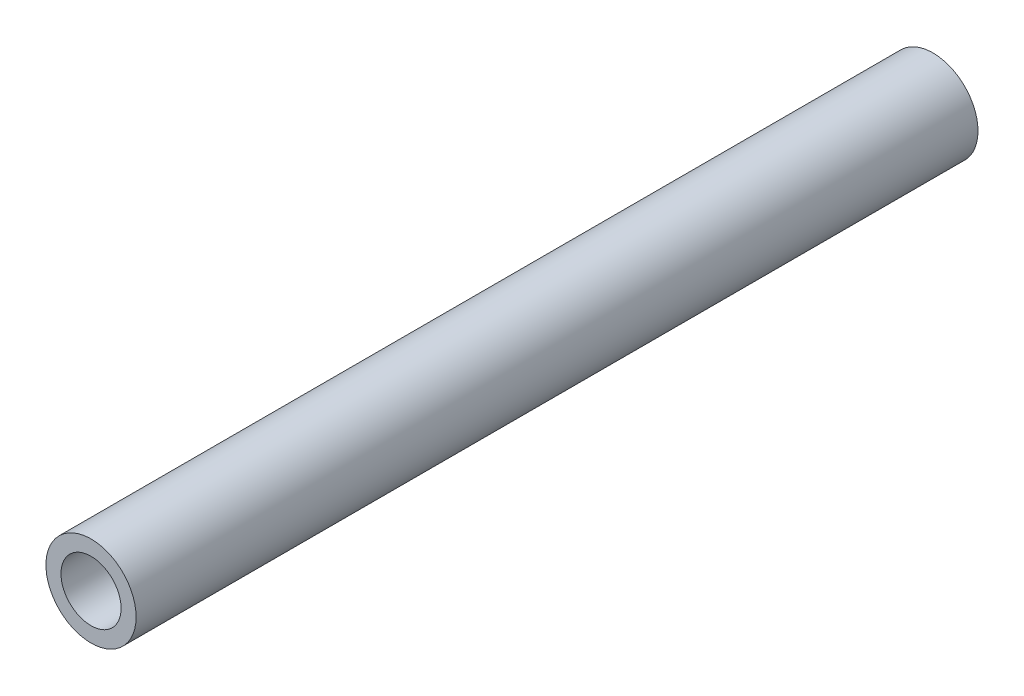
ISO-10303-21;
HEADER;
FILE_DESCRIPTION(('STEP AP214'),'2;1');
FILE_NAME('part.step','',(''),(''),'','','');
FILE_SCHEMA(('AUTOMOTIVE_DESIGN { 1 0 10303 214 1 1 1 1 }'));
ENDSEC;
DATA;
#1=APPLICATION_CONTEXT('core data for automotive mechanical design processes');
#2=APPLICATION_PROTOCOL_DEFINITION('international standard','automotive_design',2000,#1);
#3=PRODUCT_CONTEXT('',#1,'mechanical');
#4=PRODUCT('Part','Part','',(#3));
#5=PRODUCT_RELATED_PRODUCT_CATEGORY('part','',(#4));
#6=PRODUCT_DEFINITION_FORMATION('','',#4);
#7=PRODUCT_DEFINITION_CONTEXT('part definition',#1,'design');
#8=PRODUCT_DEFINITION('design','',#6,#7);
#9=PRODUCT_DEFINITION_SHAPE('','',#8);
#10=(LENGTH_UNIT() NAMED_UNIT(*) SI_UNIT(.MILLI.,.METRE.));
#11=(NAMED_UNIT(*) PLANE_ANGLE_UNIT() SI_UNIT($,.RADIAN.));
#12=(NAMED_UNIT(*) SI_UNIT($,.STERADIAN.) SOLID_ANGLE_UNIT());
#13=UNCERTAINTY_MEASURE_WITH_UNIT(LENGTH_MEASURE(1.E-05),#10,'distance_accuracy_value','');
#14=(GEOMETRIC_REPRESENTATION_CONTEXT(3) GLOBAL_UNCERTAINTY_ASSIGNED_CONTEXT((#13)) GLOBAL_UNIT_ASSIGNED_CONTEXT((#10,
#11,#12)) REPRESENTATION_CONTEXT('',''));
#15=CARTESIAN_POINT('',(0.,0.,0.));
#16=DIRECTION('',(0.,0.,1.));
#17=DIRECTION('',(1.,0.,0.));
#18=AXIS2_PLACEMENT_3D('',#15,#16,#17);
#19=CARTESIAN_POINT('',(0.,0.,-140.));
#20=DIRECTION('',(0.,0.,1.));
#21=DIRECTION('',(1.,0.,0.));
#22=AXIS2_PLACEMENT_3D('',#19,#20,#21);
#23=CYLINDRICAL_SURFACE('',#22,15.);
#24=CARTESIAN_POINT('',(0.,0.,-140.));
#25=DIRECTION('',(0.,0.,1.));
#26=DIRECTION('',(1.,0.,0.));
#27=AXIS2_PLACEMENT_3D('',#24,#25,#26);
#28=CIRCLE('',#27,15.);
#29=CARTESIAN_POINT('',(15.,0.,-140.));
#30=VERTEX_POINT('',#29);
#31=EDGE_CURVE('E10',#30,#30,#28,.T.);
#32=ORIENTED_EDGE('',*,*,#31,.T.);
#33=EDGE_LOOP('',(#32));
#34=FACE_BOUND('',#33,.T.);
#35=CARTESIAN_POINT('',(0.,0.,140.));
#36=DIRECTION('',(0.,0.,1.));
#37=DIRECTION('',(1.,0.,0.));
#38=AXIS2_PLACEMENT_3D('',#35,#36,#37);
#39=CIRCLE('',#38,15.);
#40=CARTESIAN_POINT('',(15.,0.,140.));
#41=VERTEX_POINT('',#40);
#42=EDGE_CURVE('E45',#41,#41,#39,.T.);
#43=ORIENTED_EDGE('',*,*,#42,.F.);
#44=EDGE_LOOP('',(#43));
#45=FACE_BOUND('',#44,.T.);
#46=ADVANCED_FACE('F39',(#34,#45),#23,.T.);
#47=CARTESIAN_POINT('',(0.,0.,-140.));
#48=DIRECTION('',(0.,0.,1.));
#49=DIRECTION('',(1.,0.,0.));
#50=AXIS2_PLACEMENT_3D('',#47,#48,#49);
#51=PLANE('',#50);
#52=CARTESIAN_POINT('',(0.,0.,-140.));
#53=DIRECTION('',(0.,0.,1.));
#54=DIRECTION('',(1.,0.,0.));
#55=AXIS2_PLACEMENT_3D('',#52,#53,#54);
#56=CIRCLE('',#55,10.);
#57=CARTESIAN_POINT('',(10.,0.,-140.));
#58=VERTEX_POINT('',#57);
#59=EDGE_CURVE('E47',#58,#58,#56,.T.);
#60=ORIENTED_EDGE('',*,*,#59,.T.);
#61=EDGE_LOOP('',(#60));
#62=FACE_BOUND('',#61,.T.);
#63=ORIENTED_EDGE('',*,*,#31,.F.);
#64=EDGE_LOOP('',(#63));
#65=FACE_BOUND('',#64,.T.);
#66=ADVANCED_FACE('F60',(#62,#65),#51,.F.);
#67=CARTESIAN_POINT('',(0.,0.,140.));
#68=DIRECTION('',(0.,0.,1.));
#69=DIRECTION('',(1.,0.,0.));
#70=AXIS2_PLACEMENT_3D('',#67,#68,#69);
#71=PLANE('',#70);
#72=CARTESIAN_POINT('',(0.,0.,140.));
#73=DIRECTION('',(0.,0.,1.));
#74=DIRECTION('',(1.,0.,0.));
#75=AXIS2_PLACEMENT_3D('',#72,#73,#74);
#76=CIRCLE('',#75,10.);
#77=CARTESIAN_POINT('',(10.,0.,140.));
#78=VERTEX_POINT('',#77);
#79=EDGE_CURVE('E51',#78,#78,#76,.T.);
#80=ORIENTED_EDGE('',*,*,#79,.F.);
#81=EDGE_LOOP('',(#80));
#82=FACE_BOUND('',#81,.T.);
#83=ORIENTED_EDGE('',*,*,#42,.T.);
#84=EDGE_LOOP('',(#83));
#85=FACE_BOUND('',#84,.T.);
#86=ADVANCED_FACE('F64',(#82,#85),#71,.T.);
#87=CARTESIAN_POINT('',(0.,0.,-140.));
#88=DIRECTION('',(0.,0.,1.));
#89=DIRECTION('',(1.,0.,0.));
#90=AXIS2_PLACEMENT_3D('',#87,#88,#89);
#91=CYLINDRICAL_SURFACE('',#90,10.);
#92=ORIENTED_EDGE('',*,*,#59,.F.);
#93=EDGE_LOOP('',(#92));
#94=FACE_BOUND('',#93,.T.);
#95=ORIENTED_EDGE('',*,*,#79,.T.);
#96=EDGE_LOOP('',(#95));
#97=FACE_BOUND('',#96,.T.);
#98=ADVANCED_FACE('F58',(#94,#97),#91,.F.);
#99=CLOSED_SHELL('',(#46,#66,#86,#98));
#100=MANIFOLD_SOLID_BREP('B2',#99);
#101=ADVANCED_BREP_SHAPE_REPRESENTATION('',(#18,#100),#14);
#102=SHAPE_DEFINITION_REPRESENTATION(#9,#101);
ENDSEC;
END-ISO-10303-21;
